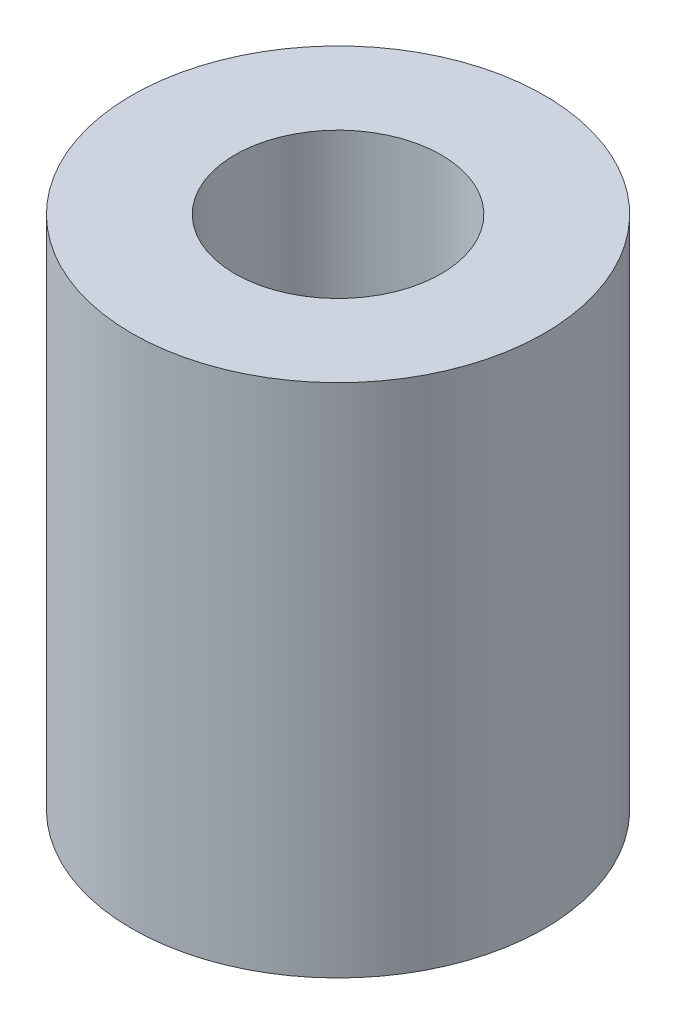
ISO-10303-21;
HEADER;
FILE_DESCRIPTION(('STEP AP214'),'2;1');
FILE_NAME('part.step','',(''),(''),'','','');
FILE_SCHEMA(('AUTOMOTIVE_DESIGN { 1 0 10303 214 1 1 1 1 }'));
ENDSEC;
DATA;
#1=APPLICATION_CONTEXT('core data for automotive mechanical design processes');
#2=APPLICATION_PROTOCOL_DEFINITION('international standard','automotive_design',2000,#1);
#3=PRODUCT_CONTEXT('',#1,'mechanical');
#4=PRODUCT('Part','Part','',(#3));
#5=PRODUCT_RELATED_PRODUCT_CATEGORY('part','',(#4));
#6=PRODUCT_DEFINITION_FORMATION('','',#4);
#7=PRODUCT_DEFINITION_CONTEXT('part definition',#1,'design');
#8=PRODUCT_DEFINITION('design','',#6,#7);
#9=PRODUCT_DEFINITION_SHAPE('','',#8);
#10=(LENGTH_UNIT() NAMED_UNIT(*) SI_UNIT(.MILLI.,.METRE.));
#11=(NAMED_UNIT(*) PLANE_ANGLE_UNIT() SI_UNIT($,.RADIAN.));
#12=(NAMED_UNIT(*) SI_UNIT($,.STERADIAN.) SOLID_ANGLE_UNIT());
#13=UNCERTAINTY_MEASURE_WITH_UNIT(LENGTH_MEASURE(1.E-05),#10,'distance_accuracy_value','');
#14=(GEOMETRIC_REPRESENTATION_CONTEXT(3) GLOBAL_UNCERTAINTY_ASSIGNED_CONTEXT((#13)) GLOBAL_UNIT_ASSIGNED_CONTEXT((#10,
#11,#12)) REPRESENTATION_CONTEXT('',''));
#15=CARTESIAN_POINT('',(0.,0.,0.));
#16=DIRECTION('',(0.,0.,1.));
#17=DIRECTION('',(1.,0.,0.));
#18=AXIS2_PLACEMENT_3D('',#15,#16,#17);
#19=CARTESIAN_POINT('',(0.,0.,0.));
#20=DIRECTION('',(0.,1.,0.));
#21=DIRECTION('',(0.,0.,1.));
#22=AXIS2_PLACEMENT_3D('',#19,#20,#21);
#23=CYLINDRICAL_SURFACE('',#22,3.175);
#24=CARTESIAN_POINT('',(0.,0.,0.));
#25=DIRECTION('',(0.,1.,0.));
#26=DIRECTION('',(0.,0.,1.));
#27=AXIS2_PLACEMENT_3D('',#24,#25,#26);
#28=CIRCLE('',#27,3.175);
#29=CARTESIAN_POINT('',(0.,0.,3.175));
#30=VERTEX_POINT('',#29);
#31=EDGE_CURVE('E45',#30,#30,#28,.T.);
#32=ORIENTED_EDGE('',*,*,#31,.F.);
#33=EDGE_LOOP('',(#32));
#34=FACE_BOUND('',#33,.T.);
#35=CARTESIAN_POINT('',(0.,12.5,0.));
#36=DIRECTION('',(0.,1.,0.));
#37=DIRECTION('',(0.,0.,1.));
#38=AXIS2_PLACEMENT_3D('',#35,#36,#37);
#39=CIRCLE('',#38,3.175);
#40=CARTESIAN_POINT('',(0.,12.5,3.175));
#41=VERTEX_POINT('',#40);
#42=EDGE_CURVE('E36',#41,#41,#39,.F.);
#43=ORIENTED_EDGE('',*,*,#42,.F.);
#44=EDGE_LOOP('',(#43));
#45=FACE_BOUND('',#44,.T.);
#46=ADVANCED_FACE('F32',(#34,#45),#23,.F.);
#47=CARTESIAN_POINT('',(0.,25.,0.));
#48=DIRECTION('',(0.,-1.,0.));
#49=DIRECTION('',(0.,0.,-1.));
#50=AXIS2_PLACEMENT_3D('',#47,#48,#49);
#51=CYLINDRICAL_SURFACE('',#50,10.);
#52=CARTESIAN_POINT('',(0.,25.,0.));
#53=DIRECTION('',(0.,1.,0.));
#54=DIRECTION('',(0.,0.,1.));
#55=AXIS2_PLACEMENT_3D('',#52,#53,#54);
#56=CIRCLE('',#55,10.);
#57=CARTESIAN_POINT('',(0.,25.,10.));
#58=VERTEX_POINT('',#57);
#59=EDGE_CURVE('E10',#58,#58,#56,.T.);
#60=ORIENTED_EDGE('',*,*,#59,.F.);
#61=EDGE_LOOP('',(#60));
#62=FACE_BOUND('',#61,.T.);
#63=CARTESIAN_POINT('',(0.,0.,0.));
#64=DIRECTION('',(0.,1.,0.));
#65=DIRECTION('',(0.,0.,1.));
#66=AXIS2_PLACEMENT_3D('',#63,#64,#65);
#67=CIRCLE('',#66,10.);
#68=CARTESIAN_POINT('',(0.,0.,10.));
#69=VERTEX_POINT('',#68);
#70=EDGE_CURVE('E40',#69,#69,#67,.T.);
#71=ORIENTED_EDGE('',*,*,#70,.T.);
#72=EDGE_LOOP('',(#71));
#73=FACE_BOUND('',#72,.T.);
#74=ADVANCED_FACE('F34',(#62,#73),#51,.T.);
#75=CARTESIAN_POINT('',(0.,25.,0.));
#76=DIRECTION('',(0.,1.,0.));
#77=DIRECTION('',(0.,0.,1.));
#78=AXIS2_PLACEMENT_3D('',#75,#76,#77);
#79=PLANE('',#78);
#80=CARTESIAN_POINT('',(0.,25.,0.));
#81=DIRECTION('',(0.,1.,0.));
#82=DIRECTION('',(0.,0.,1.));
#83=AXIS2_PLACEMENT_3D('',#80,#81,#82);
#84=CIRCLE('',#83,5.);
#85=CARTESIAN_POINT('',(0.,25.,5.));
#86=VERTEX_POINT('',#85);
#87=EDGE_CURVE('E49',#86,#86,#84,.T.);
#88=ORIENTED_EDGE('',*,*,#87,.F.);
#89=EDGE_LOOP('',(#88));
#90=FACE_BOUND('',#89,.T.);
#91=ORIENTED_EDGE('',*,*,#59,.T.);
#92=EDGE_LOOP('',(#91));
#93=FACE_BOUND('',#92,.T.);
#94=ADVANCED_FACE('F67',(#90,#93),#79,.T.);
#95=CARTESIAN_POINT('',(0.,0.,0.));
#96=DIRECTION('',(0.,1.,0.));
#97=DIRECTION('',(0.,0.,1.));
#98=AXIS2_PLACEMENT_3D('',#95,#96,#97);
#99=PLANE('',#98);
#100=ORIENTED_EDGE('',*,*,#31,.T.);
#101=EDGE_LOOP('',(#100));
#102=FACE_BOUND('',#101,.T.);
#103=ORIENTED_EDGE('',*,*,#70,.F.);
#104=EDGE_LOOP('',(#103));
#105=FACE_BOUND('',#104,.T.);
#106=ADVANCED_FACE('F75',(#102,#105),#99,.F.);
#107=CARTESIAN_POINT('',(0.,12.5,0.));
#108=DIRECTION('',(0.,1.,0.));
#109=DIRECTION('',(0.,0.,1.));
#110=AXIS2_PLACEMENT_3D('',#107,#108,#109);
#111=PLANE('',#110);
#112=CARTESIAN_POINT('',(0.,12.5,0.));
#113=DIRECTION('',(0.,1.,0.));
#114=DIRECTION('',(0.,0.,1.));
#115=AXIS2_PLACEMENT_3D('',#112,#113,#114);
#116=CIRCLE('',#115,5.);
#117=CARTESIAN_POINT('',(0.,12.5,5.));
#118=VERTEX_POINT('',#117);
#119=EDGE_CURVE('E52',#118,#118,#116,.T.);
#120=ORIENTED_EDGE('',*,*,#119,.T.);
#121=EDGE_LOOP('',(#120));
#122=FACE_BOUND('',#121,.T.);
#123=ORIENTED_EDGE('',*,*,#42,.T.);
#124=EDGE_LOOP('',(#123));
#125=FACE_BOUND('',#124,.T.);
#126=ADVANCED_FACE('F59',(#122,#125),#111,.T.);
#127=CARTESIAN_POINT('',(0.,12.5,0.));
#128=DIRECTION('',(0.,1.,0.));
#129=DIRECTION('',(0.,0.,1.));
#130=AXIS2_PLACEMENT_3D('',#127,#128,#129);
#131=CYLINDRICAL_SURFACE('',#130,5.);
#132=ORIENTED_EDGE('',*,*,#119,.F.);
#133=EDGE_LOOP('',(#132));
#134=FACE_BOUND('',#133,.T.);
#135=ORIENTED_EDGE('',*,*,#87,.T.);
#136=EDGE_LOOP('',(#135));
#137=FACE_BOUND('',#136,.T.);
#138=ADVANCED_FACE('F72',(#134,#137),#131,.F.);
#139=CLOSED_SHELL('',(#46,#74,#94,#106,#126,#138));
#140=MANIFOLD_SOLID_BREP('B2',#139);
#141=ADVANCED_BREP_SHAPE_REPRESENTATION('',(#18,#140),#14);
#142=SHAPE_DEFINITION_REPRESENTATION(#9,#141);
ENDSEC;
END-ISO-10303-21;
